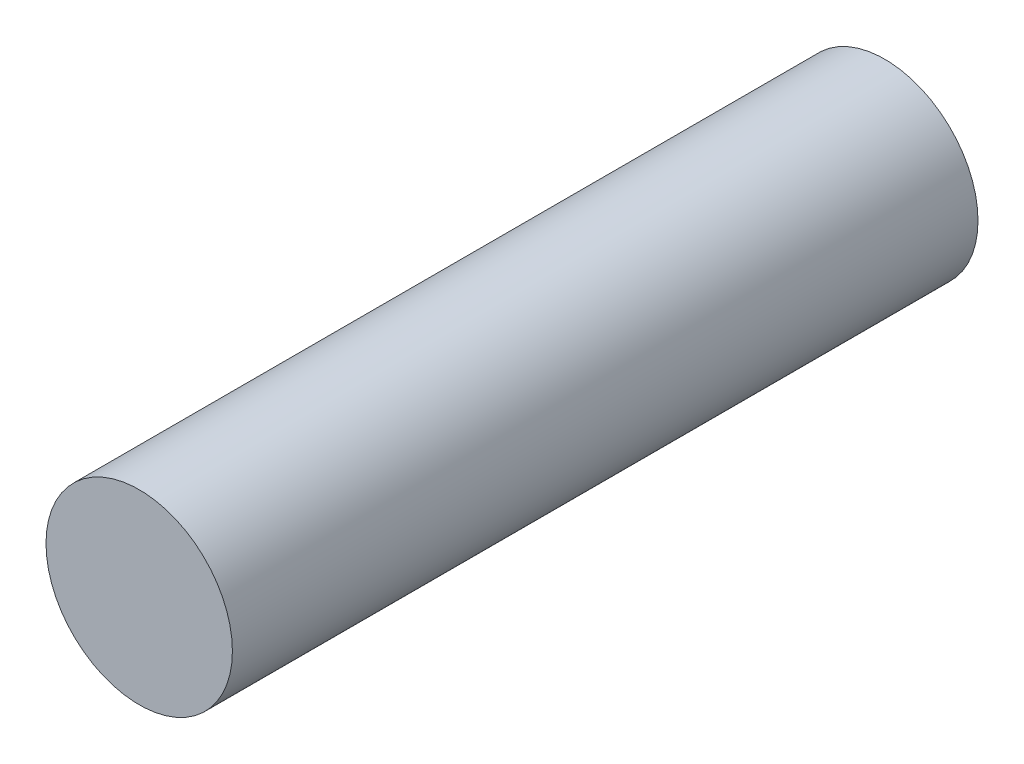
ISO-10303-21;
HEADER;
FILE_DESCRIPTION(('STEP AP214'),'2;1');
FILE_NAME('part.step','',(''),(''),'','','');
FILE_SCHEMA(('AUTOMOTIVE_DESIGN { 1 0 10303 214 1 1 1 1 }'));
ENDSEC;
DATA;
#1=APPLICATION_CONTEXT('core data for automotive mechanical design processes');
#2=APPLICATION_PROTOCOL_DEFINITION('international standard','automotive_design',2000,#1);
#3=PRODUCT_CONTEXT('',#1,'mechanical');
#4=PRODUCT('Part','Part','',(#3));
#5=PRODUCT_RELATED_PRODUCT_CATEGORY('part','',(#4));
#6=PRODUCT_DEFINITION_FORMATION('','',#4);
#7=PRODUCT_DEFINITION_CONTEXT('part definition',#1,'design');
#8=PRODUCT_DEFINITION('design','',#6,#7);
#9=PRODUCT_DEFINITION_SHAPE('','',#8);
#10=(LENGTH_UNIT() NAMED_UNIT(*) SI_UNIT(.MILLI.,.METRE.));
#11=(NAMED_UNIT(*) PLANE_ANGLE_UNIT() SI_UNIT($,.RADIAN.));
#12=(NAMED_UNIT(*) SI_UNIT($,.STERADIAN.) SOLID_ANGLE_UNIT());
#13=UNCERTAINTY_MEASURE_WITH_UNIT(LENGTH_MEASURE(1.E-05),#10,'distance_accuracy_value','');
#14=(GEOMETRIC_REPRESENTATION_CONTEXT(3) GLOBAL_UNCERTAINTY_ASSIGNED_CONTEXT((#13)) GLOBAL_UNIT_ASSIGNED_CONTEXT((#10,
#11,#12)) REPRESENTATION_CONTEXT('',''));
#15=CARTESIAN_POINT('',(0.,0.,0.));
#16=DIRECTION('',(0.,0.,1.));
#17=DIRECTION('',(1.,0.,0.));
#18=AXIS2_PLACEMENT_3D('',#15,#16,#17);
#19=CARTESIAN_POINT('',(0.,0.,25.4));
#20=DIRECTION('',(0.,0.,-1.));
#21=DIRECTION('',(-1.,0.,0.));
#22=AXIS2_PLACEMENT_3D('',#19,#20,#21);
#23=CYLINDRICAL_SURFACE('',#22,3.175);
#24=CARTESIAN_POINT('',(0.,0.,25.4));
#25=DIRECTION('',(0.,0.,1.));
#26=DIRECTION('',(1.,0.,0.));
#27=AXIS2_PLACEMENT_3D('',#24,#25,#26);
#28=CIRCLE('',#27,3.175);
#29=CARTESIAN_POINT('',(3.175,0.,25.4));
#30=VERTEX_POINT('',#29);
#31=EDGE_CURVE('E10',#30,#30,#28,.T.);
#32=ORIENTED_EDGE('',*,*,#31,.F.);
#33=EDGE_LOOP('',(#32));
#34=FACE_BOUND('',#33,.T.);
#35=CARTESIAN_POINT('',(0.,0.,0.));
#36=DIRECTION('',(0.,0.,1.));
#37=DIRECTION('',(1.,0.,0.));
#38=AXIS2_PLACEMENT_3D('',#35,#36,#37);
#39=CIRCLE('',#38,3.175);
#40=CARTESIAN_POINT('',(3.175,0.,0.));
#41=VERTEX_POINT('',#40);
#42=EDGE_CURVE('E37',#41,#41,#39,.T.);
#43=ORIENTED_EDGE('',*,*,#42,.T.);
#44=EDGE_LOOP('',(#43));
#45=FACE_BOUND('',#44,.T.);
#46=ADVANCED_FACE('F40',(#34,#45),#23,.T.);
#47=CARTESIAN_POINT('',(0.,0.,25.4));
#48=DIRECTION('',(0.,0.,1.));
#49=DIRECTION('',(1.,0.,0.));
#50=AXIS2_PLACEMENT_3D('',#47,#48,#49);
#51=PLANE('',#50);
#52=ORIENTED_EDGE('',*,*,#31,.T.);
#53=EDGE_LOOP('',(#52));
#54=FACE_BOUND('',#53,.T.);
#55=ADVANCED_FACE('F67',(#54),#51,.T.);
#56=CARTESIAN_POINT('',(0.,0.,0.));
#57=DIRECTION('',(0.,0.,1.));
#58=DIRECTION('',(1.,0.,0.));
#59=AXIS2_PLACEMENT_3D('',#56,#57,#58);
#60=PLANE('',#59);
#61=CARTESIAN_POINT('',(0.,0.,0.));
#62=DIRECTION('',(0.,0.,-1.));
#63=DIRECTION('',(-1.,0.,0.));
#64=AXIS2_PLACEMENT_3D('',#61,#62,#63);
#65=CIRCLE('',#64,1.016);
#66=CARTESIAN_POINT('',(-1.016,0.,0.));
#67=VERTEX_POINT('',#66);
#68=EDGE_CURVE('E47',#67,#67,#65,.T.);
#69=ORIENTED_EDGE('',*,*,#68,.F.);
#70=EDGE_LOOP('',(#69));
#71=FACE_BOUND('',#70,.T.);
#72=ORIENTED_EDGE('',*,*,#42,.F.);
#73=EDGE_LOOP('',(#72));
#74=FACE_BOUND('',#73,.T.);
#75=ADVANCED_FACE('F58',(#71,#74),#60,.F.);
#76=CARTESIAN_POINT('',(0.,0.,5.08));
#77=DIRECTION('',(0.,0.,-1.));
#78=DIRECTION('',(-1.,0.,0.));
#79=AXIS2_PLACEMENT_3D('',#76,#77,#78);
#80=CYLINDRICAL_SURFACE('',#79,1.016);
#81=CARTESIAN_POINT('',(0.,0.,5.08));
#82=DIRECTION('',(0.,0.,-1.));
#83=DIRECTION('',(-1.,0.,0.));
#84=AXIS2_PLACEMENT_3D('',#81,#82,#83);
#85=CIRCLE('',#84,1.016);
#86=CARTESIAN_POINT('',(-1.016,0.,5.08));
#87=VERTEX_POINT('',#86);
#88=EDGE_CURVE('E50',#87,#87,#85,.T.);
#89=ORIENTED_EDGE('',*,*,#88,.F.);
#90=EDGE_LOOP('',(#89));
#91=FACE_BOUND('',#90,.T.);
#92=ORIENTED_EDGE('',*,*,#68,.T.);
#93=EDGE_LOOP('',(#92));
#94=FACE_BOUND('',#93,.T.);
#95=ADVANCED_FACE('F60',(#91,#94),#80,.F.);
#96=CARTESIAN_POINT('',(0.,0.,5.08));
#97=DIRECTION('',(0.,0.,-1.));
#98=DIRECTION('',(-1.,0.,0.));
#99=AXIS2_PLACEMENT_3D('',#96,#97,#98);
#100=PLANE('',#99);
#101=ORIENTED_EDGE('',*,*,#88,.T.);
#102=EDGE_LOOP('',(#101));
#103=FACE_BOUND('',#102,.T.);
#104=ADVANCED_FACE('F54',(#103),#100,.T.);
#105=CLOSED_SHELL('',(#46,#55,#75,#95,#104));
#106=MANIFOLD_SOLID_BREP('B2',#105);
#107=ADVANCED_BREP_SHAPE_REPRESENTATION('',(#18,#106),#14);
#108=SHAPE_DEFINITION_REPRESENTATION(#9,#107);
ENDSEC;
END-ISO-10303-21;
